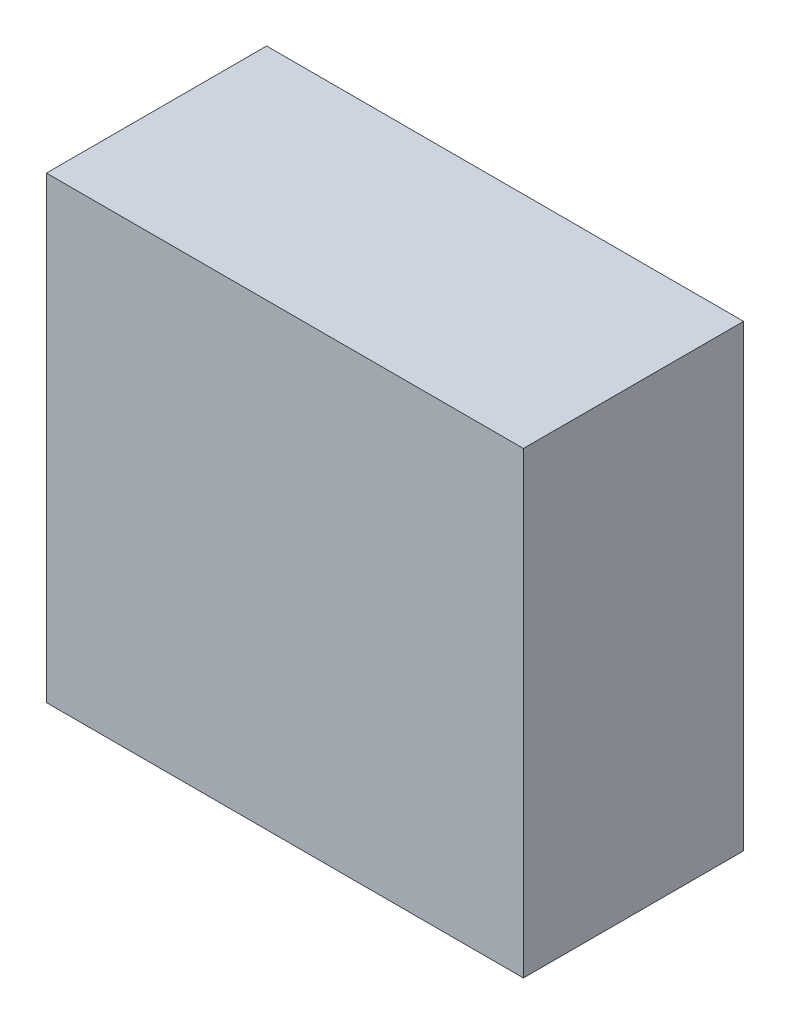
ISO-10303-21;
HEADER;
FILE_DESCRIPTION(('STEP AP214'),'2;1');
FILE_NAME('part.step','',(''),(''),'','','');
FILE_SCHEMA(('AUTOMOTIVE_DESIGN { 1 0 10303 214 1 1 1 1 }'));
ENDSEC;
DATA;
#1=APPLICATION_CONTEXT('core data for automotive mechanical design processes');
#2=APPLICATION_PROTOCOL_DEFINITION('international standard','automotive_design',2000,#1);
#3=PRODUCT_CONTEXT('',#1,'mechanical');
#4=PRODUCT('Part','Part','',(#3));
#5=PRODUCT_RELATED_PRODUCT_CATEGORY('part','',(#4));
#6=PRODUCT_DEFINITION_FORMATION('','',#4);
#7=PRODUCT_DEFINITION_CONTEXT('part definition',#1,'design');
#8=PRODUCT_DEFINITION('design','',#6,#7);
#9=PRODUCT_DEFINITION_SHAPE('','',#8);
#10=(LENGTH_UNIT() NAMED_UNIT(*) SI_UNIT(.MILLI.,.METRE.));
#11=(NAMED_UNIT(*) PLANE_ANGLE_UNIT() SI_UNIT($,.RADIAN.));
#12=(NAMED_UNIT(*) SI_UNIT($,.STERADIAN.) SOLID_ANGLE_UNIT());
#13=UNCERTAINTY_MEASURE_WITH_UNIT(LENGTH_MEASURE(1.E-05),#10,'distance_accuracy_value','');
#14=(GEOMETRIC_REPRESENTATION_CONTEXT(3) GLOBAL_UNCERTAINTY_ASSIGNED_CONTEXT((#13)) GLOBAL_UNIT_ASSIGNED_CONTEXT((#10,
#11,#12)) REPRESENTATION_CONTEXT('',''));
#15=CARTESIAN_POINT('',(0.,0.,0.));
#16=DIRECTION('',(0.,0.,1.));
#17=DIRECTION('',(1.,0.,0.));
#18=AXIS2_PLACEMENT_3D('',#15,#16,#17);
#19=CARTESIAN_POINT('',(700.,1690.,-700.));
#20=DIRECTION('',(-1.,0.,0.));
#21=DIRECTION('',(0.,0.,1.));
#22=AXIS2_PLACEMENT_3D('',#19,#20,#21);
#23=PLANE('',#22);
#24=DIRECTION('',(0.,-1.,0.));
#25=VECTOR('',#24,1.);
#26=CARTESIAN_POINT('',(700.,1690.,-640.));
#27=LINE('',#26,#25);
#28=CARTESIAN_POINT('',(700.,1815.,-640.));
#29=VERTEX_POINT('',#28);
#30=CARTESIAN_POINT('',(700.,1690.,-640.));
#31=VERTEX_POINT('',#30);
#32=EDGE_CURVE('E103',#29,#31,#27,.T.);
#33=ORIENTED_EDGE('',*,*,#32,.F.);
#34=DIRECTION('',(0.,0.,1.));
#35=VECTOR('',#34,1.);
#36=CARTESIAN_POINT('',(700.,1815.,-700.));
#37=LINE('',#36,#35);
#38=CARTESIAN_POINT('',(700.,1815.,-700.));
#39=VERTEX_POINT('',#38);
#40=EDGE_CURVE('E11',#39,#29,#37,.T.);
#41=ORIENTED_EDGE('',*,*,#40,.F.);
#42=DIRECTION('',(0.,-1.,0.));
#43=VECTOR('',#42,1.);
#44=CARTESIAN_POINT('',(700.,1690.,-700.));
#45=LINE('',#44,#43);
#46=CARTESIAN_POINT('',(700.,1690.,-700.));
#47=VERTEX_POINT('',#46);
#48=EDGE_CURVE('E97',#39,#47,#45,.T.);
#49=ORIENTED_EDGE('',*,*,#48,.T.);
#50=DIRECTION('',(0.,0.,1.));
#51=VECTOR('',#50,1.);
#52=CARTESIAN_POINT('',(700.,1690.,-700.));
#53=LINE('',#52,#51);
#54=EDGE_CURVE('E42',#47,#31,#53,.T.);
#55=ORIENTED_EDGE('',*,*,#54,.T.);
#56=EDGE_LOOP('',(#33,#41,#49,#55));
#57=FACE_BOUND('',#56,.T.);
#58=ADVANCED_FACE('F39',(#57),#23,.T.);
#59=CARTESIAN_POINT('',(700.,1815.,-700.));
#60=DIRECTION('',(0.,1.,0.));
#61=DIRECTION('',(0.,0.,1.));
#62=AXIS2_PLACEMENT_3D('',#59,#60,#61);
#63=PLANE('',#62);
#64=DIRECTION('',(-1.,0.,0.));
#65=VECTOR('',#64,1.);
#66=CARTESIAN_POINT('',(700.,1815.,-640.));
#67=LINE('',#66,#65);
#68=CARTESIAN_POINT('',(830.,1815.,-640.));
#69=VERTEX_POINT('',#68);
#70=EDGE_CURVE('E99',#69,#29,#67,.T.);
#71=ORIENTED_EDGE('',*,*,#70,.F.);
#72=DIRECTION('',(0.,0.,1.));
#73=VECTOR('',#72,1.);
#74=CARTESIAN_POINT('',(830.,1815.,-700.));
#75=LINE('',#74,#73);
#76=CARTESIAN_POINT('',(830.,1815.,-700.));
#77=VERTEX_POINT('',#76);
#78=EDGE_CURVE('E48',#77,#69,#75,.T.);
#79=ORIENTED_EDGE('',*,*,#78,.F.);
#80=DIRECTION('',(-1.,0.,0.));
#81=VECTOR('',#80,1.);
#82=CARTESIAN_POINT('',(700.,1815.,-700.));
#83=LINE('',#82,#81);
#84=EDGE_CURVE('E94',#77,#39,#83,.T.);
#85=ORIENTED_EDGE('',*,*,#84,.T.);
#86=ORIENTED_EDGE('',*,*,#40,.T.);
#87=EDGE_LOOP('',(#71,#79,#85,#86));
#88=FACE_BOUND('',#87,.T.);
#89=ADVANCED_FACE('F113',(#88),#63,.T.);
#90=CARTESIAN_POINT('',(830.,1690.,-700.));
#91=DIRECTION('',(1.,0.,0.));
#92=DIRECTION('',(0.,0.,-1.));
#93=AXIS2_PLACEMENT_3D('',#90,#91,#92);
#94=PLANE('',#93);
#95=DIRECTION('',(0.,1.,0.));
#96=VECTOR('',#95,1.);
#97=CARTESIAN_POINT('',(830.,1690.,-640.));
#98=LINE('',#97,#96);
#99=CARTESIAN_POINT('',(830.,1690.,-640.));
#100=VERTEX_POINT('',#99);
#101=EDGE_CURVE('E89',#100,#69,#98,.T.);
#102=ORIENTED_EDGE('',*,*,#101,.F.);
#103=DIRECTION('',(0.,0.,1.));
#104=VECTOR('',#103,1.);
#105=CARTESIAN_POINT('',(830.,1690.,-700.));
#106=LINE('',#105,#104);
#107=CARTESIAN_POINT('',(830.,1690.,-700.));
#108=VERTEX_POINT('',#107);
#109=EDGE_CURVE('E84',#108,#100,#106,.T.);
#110=ORIENTED_EDGE('',*,*,#109,.F.);
#111=DIRECTION('',(0.,1.,0.));
#112=VECTOR('',#111,1.);
#113=CARTESIAN_POINT('',(830.,1690.,-700.));
#114=LINE('',#113,#112);
#115=EDGE_CURVE('E87',#108,#77,#114,.T.);
#116=ORIENTED_EDGE('',*,*,#115,.T.);
#117=ORIENTED_EDGE('',*,*,#78,.T.);
#118=EDGE_LOOP('',(#102,#110,#116,#117));
#119=FACE_BOUND('',#118,.T.);
#120=ADVANCED_FACE('F86',(#119),#94,.T.);
#121=CARTESIAN_POINT('',(700.,1690.,-700.));
#122=DIRECTION('',(0.,-1.,0.));
#123=DIRECTION('',(0.,0.,-1.));
#124=AXIS2_PLACEMENT_3D('',#121,#122,#123);
#125=PLANE('',#124);
#126=DIRECTION('',(1.,0.,0.));
#127=VECTOR('',#126,1.);
#128=CARTESIAN_POINT('',(700.,1690.,-640.));
#129=LINE('',#128,#127);
#130=EDGE_CURVE('E106',#31,#100,#129,.T.);
#131=ORIENTED_EDGE('',*,*,#130,.F.);
#132=ORIENTED_EDGE('',*,*,#54,.F.);
#133=DIRECTION('',(1.,0.,0.));
#134=VECTOR('',#133,1.);
#135=CARTESIAN_POINT('',(700.,1690.,-700.));
#136=LINE('',#135,#134);
#137=EDGE_CURVE('E93',#47,#108,#136,.T.);
#138=ORIENTED_EDGE('',*,*,#137,.T.);
#139=ORIENTED_EDGE('',*,*,#109,.T.);
#140=EDGE_LOOP('',(#131,#132,#138,#139));
#141=FACE_BOUND('',#140,.T.);
#142=ADVANCED_FACE('F96',(#141),#125,.T.);
#143=CARTESIAN_POINT('',(0.,0.,-700.));
#144=DIRECTION('',(0.,0.,-1.));
#145=DIRECTION('',(-1.,0.,0.));
#146=AXIS2_PLACEMENT_3D('',#143,#144,#145);
#147=PLANE('',#146);
#148=ORIENTED_EDGE('',*,*,#48,.F.);
#149=ORIENTED_EDGE('',*,*,#84,.F.);
#150=ORIENTED_EDGE('',*,*,#115,.F.);
#151=ORIENTED_EDGE('',*,*,#137,.F.);
#152=EDGE_LOOP('',(#148,#149,#150,#151));
#153=FACE_BOUND('',#152,.T.);
#154=ADVANCED_FACE('F92',(#153),#147,.T.);
#155=CARTESIAN_POINT('',(0.,0.,-640.));
#156=DIRECTION('',(0.,0.,-1.));
#157=DIRECTION('',(-1.,0.,0.));
#158=AXIS2_PLACEMENT_3D('',#155,#156,#157);
#159=PLANE('',#158);
#160=ORIENTED_EDGE('',*,*,#32,.T.);
#161=ORIENTED_EDGE('',*,*,#130,.T.);
#162=ORIENTED_EDGE('',*,*,#101,.T.);
#163=ORIENTED_EDGE('',*,*,#70,.T.);
#164=EDGE_LOOP('',(#160,#161,#162,#163));
#165=FACE_BOUND('',#164,.T.);
#166=ADVANCED_FACE('F112',(#165),#159,.F.);
#167=CLOSED_SHELL('',(#58,#89,#120,#142,#154,#166));
#168=MANIFOLD_SOLID_BREP('B2',#167);
#169=ADVANCED_BREP_SHAPE_REPRESENTATION('',(#18,#168),#14);
#170=SHAPE_DEFINITION_REPRESENTATION(#9,#169);
ENDSEC;
END-ISO-10303-21;
